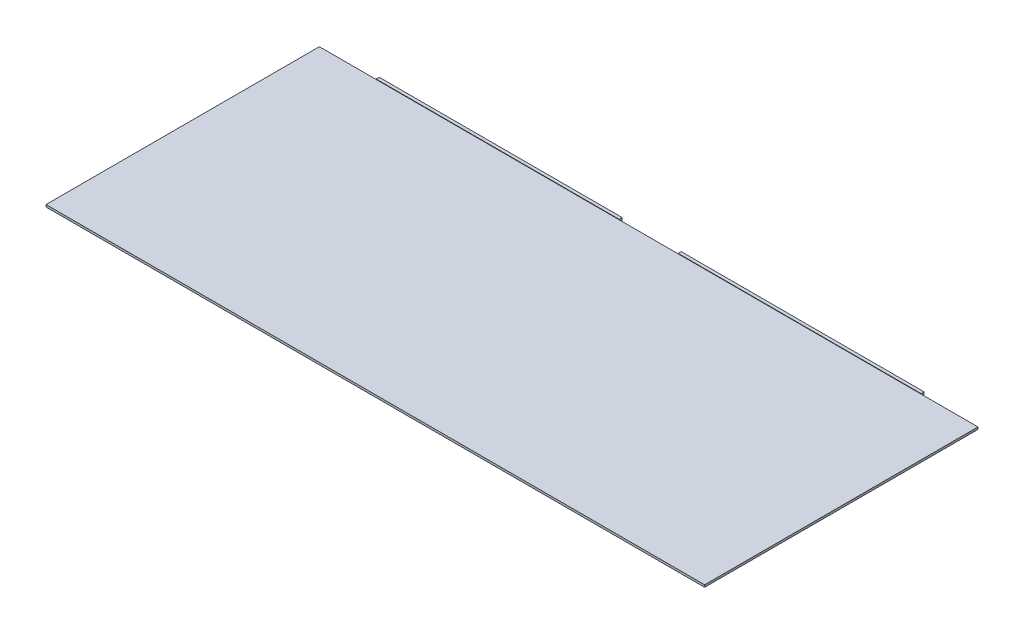
ISO-10303-21;
HEADER;
FILE_DESCRIPTION(('STEP AP214'),'2;1');
FILE_NAME('part.step','',(''),(''),'','','');
FILE_SCHEMA(('AUTOMOTIVE_DESIGN { 1 0 10303 214 1 1 1 1 }'));
ENDSEC;
DATA;
#1=APPLICATION_CONTEXT('core data for automotive mechanical design processes');
#2=APPLICATION_PROTOCOL_DEFINITION('international standard','automotive_design',2000,#1);
#3=PRODUCT_CONTEXT('',#1,'mechanical');
#4=PRODUCT('Part','Part','',(#3));
#5=PRODUCT_RELATED_PRODUCT_CATEGORY('part','',(#4));
#6=PRODUCT_DEFINITION_FORMATION('','',#4);
#7=PRODUCT_DEFINITION_CONTEXT('part definition',#1,'design');
#8=PRODUCT_DEFINITION('design','',#6,#7);
#9=PRODUCT_DEFINITION_SHAPE('','',#8);
#10=(LENGTH_UNIT() NAMED_UNIT(*) SI_UNIT(.MILLI.,.METRE.));
#11=(NAMED_UNIT(*) PLANE_ANGLE_UNIT() SI_UNIT($,.RADIAN.));
#12=(NAMED_UNIT(*) SI_UNIT($,.STERADIAN.) SOLID_ANGLE_UNIT());
#13=UNCERTAINTY_MEASURE_WITH_UNIT(LENGTH_MEASURE(1.E-05),#10,'distance_accuracy_value','');
#14=(GEOMETRIC_REPRESENTATION_CONTEXT(3) GLOBAL_UNCERTAINTY_ASSIGNED_CONTEXT((#13)) GLOBAL_UNIT_ASSIGNED_CONTEXT((#10,
#11,#12)) REPRESENTATION_CONTEXT('',''));
#15=CARTESIAN_POINT('',(0.,0.,0.));
#16=DIRECTION('',(0.,0.,1.));
#17=DIRECTION('',(1.,0.,0.));
#18=AXIS2_PLACEMENT_3D('',#15,#16,#17);
#19=CARTESIAN_POINT('',(-344.2208,1.143,-142.875));
#20=DIRECTION('',(0.,0.,1.));
#21=DIRECTION('',(1.,0.,0.));
#22=AXIS2_PLACEMENT_3D('',#19,#20,#21);
#23=PLANE('',#22);
#24=DIRECTION('',(0.,-1.,0.));
#25=VECTOR('',#24,1.);
#26=CARTESIAN_POINT('',(284.822900000001,-1.143,-142.875));
#27=LINE('',#26,#25);
#28=CARTESIAN_POINT('',(284.822900000001,1.143,-142.875));
#29=VERTEX_POINT('',#28);
#30=CARTESIAN_POINT('',(284.822900000001,-1.143,-142.875));
#31=VERTEX_POINT('',#30);
#32=EDGE_CURVE('E60',#29,#31,#27,.T.);
#33=ORIENTED_EDGE('',*,*,#32,.F.);
#34=DIRECTION('',(-1.,0.,0.));
#35=VECTOR('',#34,1.);
#36=CARTESIAN_POINT('',(-344.2208,1.143,-142.875));
#37=LINE('',#36,#35);
#38=CARTESIAN_POINT('',(344.2208,1.143,-142.875));
#39=VERTEX_POINT('',#38);
#40=EDGE_CURVE('E205',#39,#29,#37,.T.);
#41=ORIENTED_EDGE('',*,*,#40,.F.);
#42=DIRECTION('',(0.,-1.,0.));
#43=VECTOR('',#42,1.);
#44=CARTESIAN_POINT('',(344.2208,1.143,-142.875));
#45=LINE('',#44,#43);
#46=CARTESIAN_POINT('',(344.2208,-1.143,-142.875));
#47=VERTEX_POINT('',#46);
#48=EDGE_CURVE('E39',#39,#47,#45,.T.);
#49=ORIENTED_EDGE('',*,*,#48,.T.);
#50=DIRECTION('',(-1.,0.,0.));
#51=VECTOR('',#50,1.);
#52=CARTESIAN_POINT('',(-344.2208,-1.143,-142.875));
#53=LINE('',#52,#51);
#54=EDGE_CURVE('E216',#47,#31,#53,.T.);
#55=ORIENTED_EDGE('',*,*,#54,.T.);
#56=EDGE_LOOP('',(#33,#41,#49,#55));
#57=FACE_BOUND('',#56,.T.);
#58=ADVANCED_FACE('F35',(#57),#23,.F.);
#59=DIRECTION('',(0.,1.,0.));
#60=VECTOR('',#59,1.);
#61=CARTESIAN_POINT('',(30.8229000000015,1.58749999999994,-142.875));
#62=LINE('',#61,#60);
#63=CARTESIAN_POINT('',(30.8229000000015,-1.143,-142.875));
#64=VERTEX_POINT('',#63);
#65=CARTESIAN_POINT('',(30.8229000000014,1.143,-142.875));
#66=VERTEX_POINT('',#65);
#67=EDGE_CURVE('E254',#64,#66,#62,.T.);
#68=ORIENTED_EDGE('',*,*,#67,.F.);
#69=CARTESIAN_POINT('',(-30.8229000000015,-1.143,-142.875));
#70=VERTEX_POINT('',#69);
#71=EDGE_CURVE('E219',#64,#70,#53,.T.);
#72=ORIENTED_EDGE('',*,*,#71,.T.);
#73=DIRECTION('',(0.,-1.,0.));
#74=VECTOR('',#73,1.);
#75=CARTESIAN_POINT('',(-30.8229000000015,-1.143,-142.875));
#76=LINE('',#75,#74);
#77=CARTESIAN_POINT('',(-30.8229000000015,1.143,-142.875));
#78=VERTEX_POINT('',#77);
#79=EDGE_CURVE('E11',#78,#70,#76,.T.);
#80=ORIENTED_EDGE('',*,*,#79,.F.);
#81=EDGE_CURVE('E52',#66,#78,#37,.T.);
#82=ORIENTED_EDGE('',*,*,#81,.F.);
#83=EDGE_LOOP('',(#68,#72,#80,#82));
#84=FACE_BOUND('',#83,.T.);
#85=ADVANCED_FACE('F252',(#84),#23,.F.);
#86=DIRECTION('',(0.,1.,0.));
#87=VECTOR('',#86,1.);
#88=CARTESIAN_POINT('',(-284.822900000001,1.58749999999994,-142.875));
#89=LINE('',#88,#87);
#90=CARTESIAN_POINT('',(-284.822900000001,-1.143,-142.875));
#91=VERTEX_POINT('',#90);
#92=CARTESIAN_POINT('',(-284.822900000001,1.143,-142.875));
#93=VERTEX_POINT('',#92);
#94=EDGE_CURVE('E184',#91,#93,#89,.T.);
#95=ORIENTED_EDGE('',*,*,#94,.F.);
#96=CARTESIAN_POINT('',(-344.2208,-1.143,-142.875));
#97=VERTEX_POINT('',#96);
#98=EDGE_CURVE('E215',#91,#97,#53,.T.);
#99=ORIENTED_EDGE('',*,*,#98,.T.);
#100=DIRECTION('',(0.,-1.,0.));
#101=VECTOR('',#100,1.);
#102=CARTESIAN_POINT('',(-344.2208,1.143,-142.875));
#103=LINE('',#102,#101);
#104=CARTESIAN_POINT('',(-344.2208,1.143,-142.875));
#105=VERTEX_POINT('',#104);
#106=EDGE_CURVE('E226',#105,#97,#103,.T.);
#107=ORIENTED_EDGE('',*,*,#106,.F.);
#108=EDGE_CURVE('E203',#93,#105,#37,.T.);
#109=ORIENTED_EDGE('',*,*,#108,.F.);
#110=EDGE_LOOP('',(#95,#99,#107,#109));
#111=FACE_BOUND('',#110,.T.);
#112=ADVANCED_FACE('F250',(#111),#23,.F.);
#113=CARTESIAN_POINT('',(344.2208,1.143,-142.875));
#114=DIRECTION('',(-1.,0.,0.));
#115=DIRECTION('',(0.,0.,1.));
#116=AXIS2_PLACEMENT_3D('',#113,#114,#115);
#117=PLANE('',#116);
#118=DIRECTION('',(0.,0.,-1.));
#119=VECTOR('',#118,1.);
#120=CARTESIAN_POINT('',(344.2208,-1.143,-142.875));
#121=LINE('',#120,#119);
#122=CARTESIAN_POINT('',(344.2208,-1.143,142.875));
#123=VERTEX_POINT('',#122);
#124=EDGE_CURVE('E199',#123,#47,#121,.T.);
#125=ORIENTED_EDGE('',*,*,#124,.T.);
#126=ORIENTED_EDGE('',*,*,#48,.F.);
#127=DIRECTION('',(0.,0.,-1.));
#128=VECTOR('',#127,1.);
#129=CARTESIAN_POINT('',(344.2208,1.143,-142.875));
#130=LINE('',#129,#128);
#131=CARTESIAN_POINT('',(344.2208,1.143,142.875));
#132=VERTEX_POINT('',#131);
#133=EDGE_CURVE('E200',#132,#39,#130,.T.);
#134=ORIENTED_EDGE('',*,*,#133,.F.);
#135=DIRECTION('',(0.,-1.,0.));
#136=VECTOR('',#135,1.);
#137=CARTESIAN_POINT('',(344.2208,1.143,142.875));
#138=LINE('',#137,#136);
#139=EDGE_CURVE('E212',#132,#123,#138,.T.);
#140=ORIENTED_EDGE('',*,*,#139,.T.);
#141=EDGE_LOOP('',(#125,#126,#134,#140));
#142=FACE_BOUND('',#141,.T.);
#143=ADVANCED_FACE('F37',(#142),#117,.F.);
#144=CARTESIAN_POINT('',(-344.2208,1.143,-142.875));
#145=DIRECTION('',(1.,0.,0.));
#146=DIRECTION('',(0.,0.,-1.));
#147=AXIS2_PLACEMENT_3D('',#144,#145,#146);
#148=PLANE('',#147);
#149=DIRECTION('',(0.,0.,1.));
#150=VECTOR('',#149,1.);
#151=CARTESIAN_POINT('',(-344.2208,-1.143,-142.875));
#152=LINE('',#151,#150);
#153=CARTESIAN_POINT('',(-344.2208,-1.143,142.875));
#154=VERTEX_POINT('',#153);
#155=EDGE_CURVE('E218',#97,#154,#152,.T.);
#156=ORIENTED_EDGE('',*,*,#155,.T.);
#157=DIRECTION('',(0.,-1.,0.));
#158=VECTOR('',#157,1.);
#159=CARTESIAN_POINT('',(-344.2208,1.143,142.875));
#160=LINE('',#159,#158);
#161=CARTESIAN_POINT('',(-344.2208,1.143,142.875));
#162=VERTEX_POINT('',#161);
#163=EDGE_CURVE('E224',#162,#154,#160,.T.);
#164=ORIENTED_EDGE('',*,*,#163,.F.);
#165=DIRECTION('',(0.,0.,1.));
#166=VECTOR('',#165,1.);
#167=CARTESIAN_POINT('',(-344.2208,1.143,-142.875));
#168=LINE('',#167,#166);
#169=EDGE_CURVE('E207',#105,#162,#168,.T.);
#170=ORIENTED_EDGE('',*,*,#169,.F.);
#171=ORIENTED_EDGE('',*,*,#106,.T.);
#172=EDGE_LOOP('',(#156,#164,#170,#171));
#173=FACE_BOUND('',#172,.T.);
#174=ADVANCED_FACE('F243',(#173),#148,.F.);
#175=CARTESIAN_POINT('',(-344.2208,1.143,142.875));
#176=DIRECTION('',(0.,0.,-1.));
#177=DIRECTION('',(-1.,0.,0.));
#178=AXIS2_PLACEMENT_3D('',#175,#176,#177);
#179=PLANE('',#178);
#180=DIRECTION('',(1.,0.,0.));
#181=VECTOR('',#180,1.);
#182=CARTESIAN_POINT('',(-344.2208,-1.143,142.875));
#183=LINE('',#182,#181);
#184=EDGE_CURVE('E204',#154,#123,#183,.T.);
#185=ORIENTED_EDGE('',*,*,#184,.T.);
#186=ORIENTED_EDGE('',*,*,#139,.F.);
#187=DIRECTION('',(1.,0.,0.));
#188=VECTOR('',#187,1.);
#189=CARTESIAN_POINT('',(-344.2208,1.143,142.875));
#190=LINE('',#189,#188);
#191=EDGE_CURVE('E210',#162,#132,#190,.T.);
#192=ORIENTED_EDGE('',*,*,#191,.F.);
#193=ORIENTED_EDGE('',*,*,#163,.T.);
#194=EDGE_LOOP('',(#185,#186,#192,#193));
#195=FACE_BOUND('',#194,.T.);
#196=ADVANCED_FACE('F240',(#195),#179,.F.);
#197=CARTESIAN_POINT('',(0.,1.143,0.));
#198=DIRECTION('',(0.,1.,0.));
#199=DIRECTION('',(0.,0.,1.));
#200=AXIS2_PLACEMENT_3D('',#197,#198,#199);
#201=PLANE('',#200);
#202=ORIENTED_EDGE('',*,*,#133,.T.);
#203=ORIENTED_EDGE('',*,*,#40,.T.);
#204=DIRECTION('',(1.,0.,0.));
#205=VECTOR('',#204,1.);
#206=CARTESIAN_POINT('',(0.,1.143,-142.875));
#207=LINE('',#206,#205);
#208=EDGE_CURVE('E163',#66,#29,#207,.T.);
#209=ORIENTED_EDGE('',*,*,#208,.F.);
#210=ORIENTED_EDGE('',*,*,#81,.T.);
#211=EDGE_CURVE('E208',#78,#93,#37,.T.);
#212=ORIENTED_EDGE('',*,*,#211,.T.);
#213=ORIENTED_EDGE('',*,*,#108,.T.);
#214=ORIENTED_EDGE('',*,*,#169,.T.);
#215=ORIENTED_EDGE('',*,*,#191,.T.);
#216=EDGE_LOOP('',(#202,#203,#209,#210,#212,#213,#214,#215));
#217=FACE_BOUND('',#216,.T.);
#218=ADVANCED_FACE('F245',(#217),#201,.T.);
#219=CARTESIAN_POINT('',(0.,-1.143,0.));
#220=DIRECTION('',(0.,1.,0.));
#221=DIRECTION('',(0.,0.,1.));
#222=AXIS2_PLACEMENT_3D('',#219,#220,#221);
#223=PLANE('',#222);
#224=ORIENTED_EDGE('',*,*,#124,.F.);
#225=ORIENTED_EDGE('',*,*,#184,.F.);
#226=ORIENTED_EDGE('',*,*,#155,.F.);
#227=ORIENTED_EDGE('',*,*,#98,.F.);
#228=DIRECTION('',(0.,0.,1.));
#229=VECTOR('',#228,1.);
#230=CARTESIAN_POINT('',(-284.822900000001,-1.143,-146.05));
#231=LINE('',#230,#229);
#232=CARTESIAN_POINT('',(-284.822900000001,-1.143,-146.05));
#233=VERTEX_POINT('',#232);
#234=EDGE_CURVE('E193',#233,#91,#231,.T.);
#235=ORIENTED_EDGE('',*,*,#234,.F.);
#236=DIRECTION('',(-1.,0.,0.));
#237=VECTOR('',#236,1.);
#238=CARTESIAN_POINT('',(-30.8229000000015,-1.143,-146.05));
#239=LINE('',#238,#237);
#240=CARTESIAN_POINT('',(-30.8229000000015,-1.143,-146.05));
#241=VERTEX_POINT('',#240);
#242=EDGE_CURVE('E174',#241,#233,#239,.T.);
#243=ORIENTED_EDGE('',*,*,#242,.F.);
#244=DIRECTION('',(0.,0.,1.));
#245=VECTOR('',#244,1.);
#246=CARTESIAN_POINT('',(-30.8229000000015,-1.143,-146.05));
#247=LINE('',#246,#245);
#248=EDGE_CURVE('E196',#241,#70,#247,.T.);
#249=ORIENTED_EDGE('',*,*,#248,.T.);
#250=ORIENTED_EDGE('',*,*,#71,.F.);
#251=DIRECTION('',(0.,0.,1.));
#252=VECTOR('',#251,1.);
#253=CARTESIAN_POINT('',(30.8229000000015,-1.143,-146.05));
#254=LINE('',#253,#252);
#255=CARTESIAN_POINT('',(30.8229000000015,-1.143,-146.05));
#256=VERTEX_POINT('',#255);
#257=EDGE_CURVE('E146',#256,#64,#254,.T.);
#258=ORIENTED_EDGE('',*,*,#257,.F.);
#259=DIRECTION('',(-1.,0.,0.));
#260=VECTOR('',#259,1.);
#261=CARTESIAN_POINT('',(284.822900000001,-1.143,-146.05));
#262=LINE('',#261,#260);
#263=CARTESIAN_POINT('',(284.822900000001,-1.143,-146.05));
#264=VERTEX_POINT('',#263);
#265=EDGE_CURVE('E139',#264,#256,#262,.T.);
#266=ORIENTED_EDGE('',*,*,#265,.F.);
#267=DIRECTION('',(0.,0.,1.));
#268=VECTOR('',#267,1.);
#269=CARTESIAN_POINT('',(284.822900000001,-1.143,-146.05));
#270=LINE('',#269,#268);
#271=EDGE_CURVE('E144',#264,#31,#270,.T.);
#272=ORIENTED_EDGE('',*,*,#271,.T.);
#273=ORIENTED_EDGE('',*,*,#54,.F.);
#274=EDGE_LOOP('',(#224,#225,#226,#227,#235,#243,#249,#250,#258,#266,#272,#273));
#275=FACE_BOUND('',#274,.T.);
#276=ADVANCED_FACE('F142',(#275),#223,.F.);
#277=CARTESIAN_POINT('',(0.,0.,-142.875));
#278=DIRECTION('',(0.,0.,1.));
#279=DIRECTION('',(1.,0.,0.));
#280=AXIS2_PLACEMENT_3D('',#277,#278,#279);
#281=PLANE('',#280);
#282=ORIENTED_EDGE('',*,*,#211,.F.);
#283=CARTESIAN_POINT('',(-30.8229000000015,1.58749999999994,-142.875));
#284=VERTEX_POINT('',#283);
#285=EDGE_CURVE('E45',#284,#78,#76,.T.);
#286=ORIENTED_EDGE('',*,*,#285,.F.);
#287=DIRECTION('',(1.,0.,0.));
#288=VECTOR('',#287,1.);
#289=CARTESIAN_POINT('',(-30.8229000000015,1.58749999999994,-142.875));
#290=LINE('',#289,#288);
#291=CARTESIAN_POINT('',(-284.822900000001,1.58749999999994,-142.875));
#292=VERTEX_POINT('',#291);
#293=EDGE_CURVE('E175',#292,#284,#290,.T.);
#294=ORIENTED_EDGE('',*,*,#293,.F.);
#295=EDGE_CURVE('E183',#93,#292,#89,.T.);
#296=ORIENTED_EDGE('',*,*,#295,.F.);
#297=EDGE_LOOP('',(#282,#286,#294,#296));
#298=FACE_BOUND('',#297,.T.);
#299=ADVANCED_FACE('F268',(#298),#281,.T.);
#300=CARTESIAN_POINT('',(-30.8229000000015,-1.143,-146.05));
#301=DIRECTION('',(-1.,0.,0.));
#302=DIRECTION('',(0.,0.,1.));
#303=AXIS2_PLACEMENT_3D('',#300,#301,#302);
#304=PLANE('',#303);
#305=ORIENTED_EDGE('',*,*,#285,.T.);
#306=ORIENTED_EDGE('',*,*,#79,.T.);
#307=ORIENTED_EDGE('',*,*,#248,.F.);
#308=DIRECTION('',(0.,-1.,0.));
#309=VECTOR('',#308,1.);
#310=CARTESIAN_POINT('',(-30.8229000000015,-1.143,-146.05));
#311=LINE('',#310,#309);
#312=CARTESIAN_POINT('',(-30.8229000000015,1.58749999999994,-146.05));
#313=VERTEX_POINT('',#312);
#314=EDGE_CURVE('E171',#313,#241,#311,.T.);
#315=ORIENTED_EDGE('',*,*,#314,.F.);
#316=DIRECTION('',(0.,0.,1.));
#317=VECTOR('',#316,1.);
#318=CARTESIAN_POINT('',(-30.8229000000015,1.58749999999994,-146.05));
#319=LINE('',#318,#317);
#320=EDGE_CURVE('E180',#313,#284,#319,.T.);
#321=ORIENTED_EDGE('',*,*,#320,.T.);
#322=EDGE_LOOP('',(#305,#306,#307,#315,#321));
#323=FACE_BOUND('',#322,.T.);
#324=ADVANCED_FACE('F257',(#323),#304,.F.);
#325=CARTESIAN_POINT('',(-284.822900000001,1.58749999999994,-146.05));
#326=DIRECTION('',(1.,0.,0.));
#327=DIRECTION('',(0.,1.,0.));
#328=AXIS2_PLACEMENT_3D('',#325,#326,#327);
#329=PLANE('',#328);
#330=ORIENTED_EDGE('',*,*,#94,.T.);
#331=ORIENTED_EDGE('',*,*,#295,.T.);
#332=DIRECTION('',(0.,0.,1.));
#333=VECTOR('',#332,1.);
#334=CARTESIAN_POINT('',(-284.822900000001,1.58749999999994,-146.05));
#335=LINE('',#334,#333);
#336=CARTESIAN_POINT('',(-284.822900000001,1.58749999999994,-146.05));
#337=VERTEX_POINT('',#336);
#338=EDGE_CURVE('E190',#337,#292,#335,.T.);
#339=ORIENTED_EDGE('',*,*,#338,.F.);
#340=DIRECTION('',(0.,1.,0.));
#341=VECTOR('',#340,1.);
#342=CARTESIAN_POINT('',(-284.822900000001,1.58749999999994,-146.05));
#343=LINE('',#342,#341);
#344=EDGE_CURVE('E177',#233,#337,#343,.T.);
#345=ORIENTED_EDGE('',*,*,#344,.F.);
#346=ORIENTED_EDGE('',*,*,#234,.T.);
#347=EDGE_LOOP('',(#330,#331,#339,#345,#346));
#348=FACE_BOUND('',#347,.T.);
#349=ADVANCED_FACE('F321',(#348),#329,.F.);
#350=CARTESIAN_POINT('',(-30.8229000000015,1.58749999999994,-146.05));
#351=DIRECTION('',(0.,-1.,0.));
#352=DIRECTION('',(0.,0.,-1.));
#353=AXIS2_PLACEMENT_3D('',#350,#351,#352);
#354=PLANE('',#353);
#355=ORIENTED_EDGE('',*,*,#293,.T.);
#356=ORIENTED_EDGE('',*,*,#320,.F.);
#357=DIRECTION('',(1.,0.,0.));
#358=VECTOR('',#357,1.);
#359=CARTESIAN_POINT('',(-30.8229000000015,1.58749999999994,-146.05));
#360=LINE('',#359,#358);
#361=EDGE_CURVE('E179',#337,#313,#360,.T.);
#362=ORIENTED_EDGE('',*,*,#361,.F.);
#363=ORIENTED_EDGE('',*,*,#338,.T.);
#364=EDGE_LOOP('',(#355,#356,#362,#363));
#365=FACE_BOUND('',#364,.T.);
#366=ADVANCED_FACE('F324',(#365),#354,.F.);
#367=CARTESIAN_POINT('',(0.,0.,-146.05));
#368=DIRECTION('',(0.,0.,1.));
#369=DIRECTION('',(1.,0.,0.));
#370=AXIS2_PLACEMENT_3D('',#367,#368,#369);
#371=PLANE('',#370);
#372=ORIENTED_EDGE('',*,*,#314,.T.);
#373=ORIENTED_EDGE('',*,*,#242,.T.);
#374=ORIENTED_EDGE('',*,*,#344,.T.);
#375=ORIENTED_EDGE('',*,*,#361,.T.);
#376=EDGE_LOOP('',(#372,#373,#374,#375));
#377=FACE_BOUND('',#376,.T.);
#378=ADVANCED_FACE('F262',(#377),#371,.F.);
#379=CARTESIAN_POINT('',(284.822900000001,-1.143,-146.05));
#380=DIRECTION('',(-1.,0.,0.));
#381=DIRECTION('',(0.,-1.,0.));
#382=AXIS2_PLACEMENT_3D('',#379,#380,#381);
#383=PLANE('',#382);
#384=CARTESIAN_POINT('',(284.822900000001,1.58749999999994,-142.875));
#385=VERTEX_POINT('',#384);
#386=EDGE_CURVE('E278',#385,#29,#27,.T.);
#387=ORIENTED_EDGE('',*,*,#386,.T.);
#388=ORIENTED_EDGE('',*,*,#32,.T.);
#389=ORIENTED_EDGE('',*,*,#271,.F.);
#390=DIRECTION('',(0.,-1.,0.));
#391=VECTOR('',#390,1.);
#392=CARTESIAN_POINT('',(284.822900000001,-1.143,-146.05));
#393=LINE('',#392,#391);
#394=CARTESIAN_POINT('',(284.822900000001,1.58749999999994,-146.05));
#395=VERTEX_POINT('',#394);
#396=EDGE_CURVE('E150',#395,#264,#393,.T.);
#397=ORIENTED_EDGE('',*,*,#396,.F.);
#398=DIRECTION('',(0.,0.,1.));
#399=VECTOR('',#398,1.);
#400=CARTESIAN_POINT('',(284.822900000001,1.58749999999994,-146.05));
#401=LINE('',#400,#399);
#402=EDGE_CURVE('E285',#395,#385,#401,.T.);
#403=ORIENTED_EDGE('',*,*,#402,.T.);
#404=EDGE_LOOP('',(#387,#388,#389,#397,#403));
#405=FACE_BOUND('',#404,.T.);
#406=ADVANCED_FACE('F162',(#405),#383,.F.);
#407=CARTESIAN_POINT('',(30.8229000000015,1.58749999999994,-146.05));
#408=DIRECTION('',(1.,0.,0.));
#409=DIRECTION('',(0.,0.,-1.));
#410=AXIS2_PLACEMENT_3D('',#407,#408,#409);
#411=PLANE('',#410);
#412=ORIENTED_EDGE('',*,*,#67,.T.);
#413=CARTESIAN_POINT('',(30.8229000000015,1.58749999999994,-142.875));
#414=VERTEX_POINT('',#413);
#415=EDGE_CURVE('E273',#66,#414,#62,.T.);
#416=ORIENTED_EDGE('',*,*,#415,.T.);
#417=DIRECTION('',(0.,0.,1.));
#418=VECTOR('',#417,1.);
#419=CARTESIAN_POINT('',(30.8229000000015,1.58749999999994,-146.05));
#420=LINE('',#419,#418);
#421=CARTESIAN_POINT('',(30.8229000000015,1.58749999999994,-146.05));
#422=VERTEX_POINT('',#421);
#423=EDGE_CURVE('E167',#422,#414,#420,.T.);
#424=ORIENTED_EDGE('',*,*,#423,.F.);
#425=DIRECTION('',(0.,1.,0.));
#426=VECTOR('',#425,1.);
#427=CARTESIAN_POINT('',(30.8229000000015,1.58749999999994,-146.05));
#428=LINE('',#427,#426);
#429=EDGE_CURVE('E149',#256,#422,#428,.T.);
#430=ORIENTED_EDGE('',*,*,#429,.F.);
#431=ORIENTED_EDGE('',*,*,#257,.T.);
#432=EDGE_LOOP('',(#412,#416,#424,#430,#431));
#433=FACE_BOUND('',#432,.T.);
#434=ADVANCED_FACE('F280',(#433),#411,.F.);
#435=CARTESIAN_POINT('',(284.822900000001,1.58749999999994,-146.05));
#436=DIRECTION('',(0.,-1.,0.));
#437=DIRECTION('',(0.,0.,-1.));
#438=AXIS2_PLACEMENT_3D('',#435,#436,#437);
#439=PLANE('',#438);
#440=DIRECTION('',(1.,0.,0.));
#441=VECTOR('',#440,1.);
#442=CARTESIAN_POINT('',(284.822900000001,1.58749999999994,-142.875));
#443=LINE('',#442,#441);
#444=EDGE_CURVE('E159',#414,#385,#443,.T.);
#445=ORIENTED_EDGE('',*,*,#444,.T.);
#446=ORIENTED_EDGE('',*,*,#402,.F.);
#447=DIRECTION('',(1.,0.,0.));
#448=VECTOR('',#447,1.);
#449=CARTESIAN_POINT('',(284.822900000001,1.58749999999994,-146.05));
#450=LINE('',#449,#448);
#451=EDGE_CURVE('E155',#422,#395,#450,.T.);
#452=ORIENTED_EDGE('',*,*,#451,.F.);
#453=ORIENTED_EDGE('',*,*,#423,.T.);
#454=EDGE_LOOP('',(#445,#446,#452,#453));
#455=FACE_BOUND('',#454,.T.);
#456=ADVANCED_FACE('F287',(#455),#439,.F.);
#457=CARTESIAN_POINT('',(0.,0.,-146.05));
#458=DIRECTION('',(0.,0.,1.));
#459=DIRECTION('',(1.,0.,0.));
#460=AXIS2_PLACEMENT_3D('',#457,#458,#459);
#461=PLANE('',#460);
#462=ORIENTED_EDGE('',*,*,#396,.T.);
#463=ORIENTED_EDGE('',*,*,#265,.T.);
#464=ORIENTED_EDGE('',*,*,#429,.T.);
#465=ORIENTED_EDGE('',*,*,#451,.T.);
#466=EDGE_LOOP('',(#462,#463,#464,#465));
#467=FACE_BOUND('',#466,.T.);
#468=ADVANCED_FACE('F153',(#467),#461,.F.);
#469=CARTESIAN_POINT('',(0.,0.,-142.875));
#470=DIRECTION('',(0.,0.,1.));
#471=DIRECTION('',(1.,0.,0.));
#472=AXIS2_PLACEMENT_3D('',#469,#470,#471);
#473=PLANE('',#472);
#474=ORIENTED_EDGE('',*,*,#415,.F.);
#475=ORIENTED_EDGE('',*,*,#208,.T.);
#476=ORIENTED_EDGE('',*,*,#386,.F.);
#477=ORIENTED_EDGE('',*,*,#444,.F.);
#478=EDGE_LOOP('',(#474,#475,#476,#477));
#479=FACE_BOUND('',#478,.T.);
#480=ADVANCED_FACE('F274',(#479),#473,.T.);
#481=CLOSED_SHELL('',(#58,#85,#112,#143,#174,#196,#218,#276,#299,#324,#349,#366,#378,#406,#434,
#456,#468,#480));
#482=MANIFOLD_SOLID_BREP('B2',#481);
#483=ADVANCED_BREP_SHAPE_REPRESENTATION('',(#18,#482),#14);
#484=SHAPE_DEFINITION_REPRESENTATION(#9,#483);
ENDSEC;
END-ISO-10303-21;
